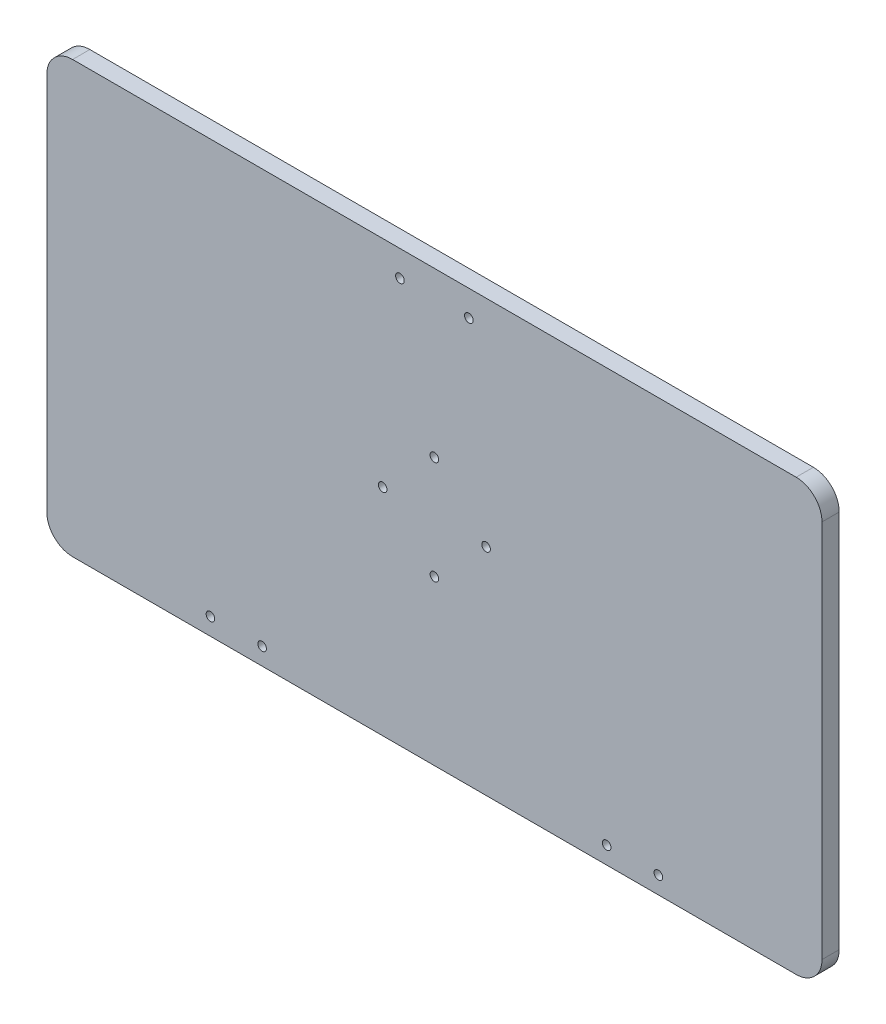
ISO-10303-21;
HEADER;
FILE_DESCRIPTION(('STEP AP214'),'2;1');
FILE_NAME('part.step','',(''),(''),'','','');
FILE_SCHEMA(('AUTOMOTIVE_DESIGN { 1 0 10303 214 1 1 1 1 }'));
ENDSEC;
DATA;
#1=APPLICATION_CONTEXT('core data for automotive mechanical design processes');
#2=APPLICATION_PROTOCOL_DEFINITION('international standard','automotive_design',2000,#1);
#3=PRODUCT_CONTEXT('',#1,'mechanical');
#4=PRODUCT('Part','Part','',(#3));
#5=PRODUCT_RELATED_PRODUCT_CATEGORY('part','',(#4));
#6=PRODUCT_DEFINITION_FORMATION('','',#4);
#7=PRODUCT_DEFINITION_CONTEXT('part definition',#1,'design');
#8=PRODUCT_DEFINITION('design','',#6,#7);
#9=PRODUCT_DEFINITION_SHAPE('','',#8);
#10=(LENGTH_UNIT() NAMED_UNIT(*) SI_UNIT(.MILLI.,.METRE.));
#11=(NAMED_UNIT(*) PLANE_ANGLE_UNIT() SI_UNIT($,.RADIAN.));
#12=(NAMED_UNIT(*) SI_UNIT($,.STERADIAN.) SOLID_ANGLE_UNIT());
#13=UNCERTAINTY_MEASURE_WITH_UNIT(LENGTH_MEASURE(1.E-05),#10,'distance_accuracy_value','');
#14=(GEOMETRIC_REPRESENTATION_CONTEXT(3) GLOBAL_UNCERTAINTY_ASSIGNED_CONTEXT((#13)) GLOBAL_UNIT_ASSIGNED_CONTEXT((#10,
#11,#12)) REPRESENTATION_CONTEXT('',''));
#15=CARTESIAN_POINT('',(0.,0.,0.));
#16=DIRECTION('',(0.,0.,1.));
#17=DIRECTION('',(1.,0.,0.));
#18=AXIS2_PLACEMENT_3D('',#15,#16,#17);
#19=CARTESIAN_POINT('',(435.,235.,10.));
#20=DIRECTION('',(0.,0.,-1.));
#21=DIRECTION('',(-1.,0.,0.));
#22=AXIS2_PLACEMENT_3D('',#19,#20,#21);
#23=PLANE('',#22);
#24=CARTESIAN_POINT('',(435.,235.,10.));
#25=DIRECTION('',(0.,0.,1.));
#26=DIRECTION('',(-1.,0.,0.));
#27=AXIS2_PLACEMENT_3D('',#24,#25,#26);
#28=CIRCLE('',#27,15.);
#29=CARTESIAN_POINT('',(450.,235.,10.));
#30=VERTEX_POINT('',#29);
#31=CARTESIAN_POINT('',(435.,250.,10.));
#32=VERTEX_POINT('',#31);
#33=EDGE_CURVE('E164',#30,#32,#28,.T.);
#34=ORIENTED_EDGE('',*,*,#33,.T.);
#35=DIRECTION('',(-1.,0.,0.));
#36=VECTOR('',#35,1.);
#37=CARTESIAN_POINT('',(15.,250.,10.));
#38=LINE('',#37,#36);
#39=CARTESIAN_POINT('',(15.,250.,10.));
#40=VERTEX_POINT('',#39);
#41=EDGE_CURVE('E100',#32,#40,#38,.T.);
#42=ORIENTED_EDGE('',*,*,#41,.T.);
#43=CARTESIAN_POINT('',(15.,235.,10.));
#44=DIRECTION('',(0.,0.,1.));
#45=DIRECTION('',(-1.,0.,0.));
#46=AXIS2_PLACEMENT_3D('',#43,#44,#45);
#47=CIRCLE('',#46,15.);
#48=CARTESIAN_POINT('',(0.,235.,10.));
#49=VERTEX_POINT('',#48);
#50=EDGE_CURVE('E185',#40,#49,#47,.T.);
#51=ORIENTED_EDGE('',*,*,#50,.T.);
#52=DIRECTION('',(0.,-1.,0.));
#53=VECTOR('',#52,1.);
#54=CARTESIAN_POINT('',(0.,15.0000000000001,10.));
#55=LINE('',#54,#53);
#56=CARTESIAN_POINT('',(0.,15.0000000000001,10.));
#57=VERTEX_POINT('',#56);
#58=EDGE_CURVE('E199',#49,#57,#55,.T.);
#59=ORIENTED_EDGE('',*,*,#58,.T.);
#60=CARTESIAN_POINT('',(15.,15.,10.));
#61=DIRECTION('',(0.,0.,1.));
#62=DIRECTION('',(-1.,0.,0.));
#63=AXIS2_PLACEMENT_3D('',#60,#61,#62);
#64=CIRCLE('',#63,15.);
#65=CARTESIAN_POINT('',(15.0000000000001,0.,10.));
#66=VERTEX_POINT('',#65);
#67=EDGE_CURVE('E119',#57,#66,#64,.T.);
#68=ORIENTED_EDGE('',*,*,#67,.T.);
#69=DIRECTION('',(1.,0.,0.));
#70=VECTOR('',#69,1.);
#71=CARTESIAN_POINT('',(15.0000000000001,0.,10.));
#72=LINE('',#71,#70);
#73=CARTESIAN_POINT('',(435.,0.,10.));
#74=VERTEX_POINT('',#73);
#75=EDGE_CURVE('E113',#66,#74,#72,.T.);
#76=ORIENTED_EDGE('',*,*,#75,.T.);
#77=CARTESIAN_POINT('',(435.,15.,10.));
#78=DIRECTION('',(0.,0.,1.));
#79=DIRECTION('',(1.,0.,0.));
#80=AXIS2_PLACEMENT_3D('',#77,#78,#79);
#81=CIRCLE('',#80,15.);
#82=CARTESIAN_POINT('',(450.,15.,10.));
#83=VERTEX_POINT('',#82);
#84=EDGE_CURVE('E117',#74,#83,#81,.T.);
#85=ORIENTED_EDGE('',*,*,#84,.T.);
#86=DIRECTION('',(0.,1.,0.));
#87=VECTOR('',#86,1.);
#88=CARTESIAN_POINT('',(450.,15.,10.));
#89=LINE('',#88,#87);
#90=EDGE_CURVE('E57',#83,#30,#89,.T.);
#91=ORIENTED_EDGE('',*,*,#90,.T.);
#92=EDGE_LOOP('',(#34,#42,#51,#59,#68,#76,#85,#91));
#93=FACE_BOUND('',#92,.T.);
#94=CARTESIAN_POINT('',(255.,125.,10.));
#95=DIRECTION('',(0.,0.,1.));
#96=DIRECTION('',(1.,0.,0.));
#97=AXIS2_PLACEMENT_3D('',#94,#95,#96);
#98=CIRCLE('',#97,2.50000000000002);
#99=CARTESIAN_POINT('',(257.5,125.,10.));
#100=VERTEX_POINT('',#99);
#101=EDGE_CURVE('E146',#100,#100,#98,.T.);
#102=ORIENTED_EDGE('',*,*,#101,.F.);
#103=EDGE_LOOP('',(#102));
#104=FACE_BOUND('',#103,.T.);
#105=CARTESIAN_POINT('',(225.,95.,10.));
#106=DIRECTION('',(0.,0.,1.));
#107=DIRECTION('',(1.,0.,0.));
#108=AXIS2_PLACEMENT_3D('',#105,#106,#107);
#109=CIRCLE('',#108,2.50000000000002);
#110=CARTESIAN_POINT('',(227.5,95.,10.));
#111=VERTEX_POINT('',#110);
#112=EDGE_CURVE('E213',#111,#111,#109,.T.);
#113=ORIENTED_EDGE('',*,*,#112,.F.);
#114=EDGE_LOOP('',(#113));
#115=FACE_BOUND('',#114,.T.);
#116=CARTESIAN_POINT('',(195.,125.,10.));
#117=DIRECTION('',(0.,0.,1.));
#118=DIRECTION('',(1.,0.,0.));
#119=AXIS2_PLACEMENT_3D('',#116,#117,#118);
#120=CIRCLE('',#119,2.50000000000001);
#121=CARTESIAN_POINT('',(197.5,125.,10.));
#122=VERTEX_POINT('',#121);
#123=EDGE_CURVE('E221',#122,#122,#120,.T.);
#124=ORIENTED_EDGE('',*,*,#123,.F.);
#125=EDGE_LOOP('',(#124));
#126=FACE_BOUND('',#125,.T.);
#127=CARTESIAN_POINT('',(225.,155.,10.));
#128=DIRECTION('',(0.,0.,1.));
#129=DIRECTION('',(1.,0.,0.));
#130=AXIS2_PLACEMENT_3D('',#127,#128,#129);
#131=CIRCLE('',#130,2.50000000000001);
#132=CARTESIAN_POINT('',(227.5,155.,10.));
#133=VERTEX_POINT('',#132);
#134=EDGE_CURVE('E229',#133,#133,#131,.T.);
#135=ORIENTED_EDGE('',*,*,#134,.F.);
#136=EDGE_LOOP('',(#135));
#137=FACE_BOUND('',#136,.T.);
#138=CARTESIAN_POINT('',(325.,10.,10.));
#139=DIRECTION('',(0.,0.,1.));
#140=DIRECTION('',(1.,0.,0.));
#141=AXIS2_PLACEMENT_3D('',#138,#139,#140);
#142=CIRCLE('',#141,2.50000000000002);
#143=CARTESIAN_POINT('',(327.5,10.,10.));
#144=VERTEX_POINT('',#143);
#145=EDGE_CURVE('E237',#144,#144,#142,.T.);
#146=ORIENTED_EDGE('',*,*,#145,.F.);
#147=EDGE_LOOP('',(#146));
#148=FACE_BOUND('',#147,.T.);
#149=CARTESIAN_POINT('',(355.,10.,10.));
#150=DIRECTION('',(0.,0.,1.));
#151=DIRECTION('',(1.,0.,0.));
#152=AXIS2_PLACEMENT_3D('',#149,#150,#151);
#153=CIRCLE('',#152,2.50000000000002);
#154=CARTESIAN_POINT('',(357.5,10.,10.));
#155=VERTEX_POINT('',#154);
#156=EDGE_CURVE('E245',#155,#155,#153,.T.);
#157=ORIENTED_EDGE('',*,*,#156,.F.);
#158=EDGE_LOOP('',(#157));
#159=FACE_BOUND('',#158,.T.);
#160=CARTESIAN_POINT('',(95.0000000000001,9.99999999999994,10.));
#161=DIRECTION('',(0.,0.,1.));
#162=DIRECTION('',(-1.,0.,0.));
#163=AXIS2_PLACEMENT_3D('',#160,#161,#162);
#164=CIRCLE('',#163,2.5);
#165=CARTESIAN_POINT('',(92.5000000000001,9.99999999999994,10.));
#166=VERTEX_POINT('',#165);
#167=EDGE_CURVE('E253',#166,#166,#164,.T.);
#168=ORIENTED_EDGE('',*,*,#167,.F.);
#169=EDGE_LOOP('',(#168));
#170=FACE_BOUND('',#169,.T.);
#171=CARTESIAN_POINT('',(125.,9.99999999999994,10.));
#172=DIRECTION('',(0.,0.,1.));
#173=DIRECTION('',(-1.,0.,0.));
#174=AXIS2_PLACEMENT_3D('',#171,#172,#173);
#175=CIRCLE('',#174,2.5);
#176=CARTESIAN_POINT('',(122.5,9.99999999999994,10.));
#177=VERTEX_POINT('',#176);
#178=EDGE_CURVE('E261',#177,#177,#175,.T.);
#179=ORIENTED_EDGE('',*,*,#178,.F.);
#180=EDGE_LOOP('',(#179));
#181=FACE_BOUND('',#180,.T.);
#182=CARTESIAN_POINT('',(205.,235.,10.));
#183=DIRECTION('',(0.,0.,1.));
#184=DIRECTION('',(1.,0.,0.));
#185=AXIS2_PLACEMENT_3D('',#182,#183,#184);
#186=CIRCLE('',#185,2.5);
#187=CARTESIAN_POINT('',(207.5,235.,10.));
#188=VERTEX_POINT('',#187);
#189=EDGE_CURVE('E269',#188,#188,#186,.T.);
#190=ORIENTED_EDGE('',*,*,#189,.F.);
#191=EDGE_LOOP('',(#190));
#192=FACE_BOUND('',#191,.T.);
#193=CARTESIAN_POINT('',(245.,235.,10.));
#194=DIRECTION('',(0.,0.,1.));
#195=DIRECTION('',(1.,0.,0.));
#196=AXIS2_PLACEMENT_3D('',#193,#194,#195);
#197=CIRCLE('',#196,2.50000000000002);
#198=CARTESIAN_POINT('',(247.5,235.,10.));
#199=VERTEX_POINT('',#198);
#200=EDGE_CURVE('E277',#199,#199,#197,.T.);
#201=ORIENTED_EDGE('',*,*,#200,.F.);
#202=EDGE_LOOP('',(#201));
#203=FACE_BOUND('',#202,.T.);
#204=ADVANCED_FACE('F39',(#93,#104,#115,#126,#137,#148,#159,#170,#181,#192,#203),#23,.F.);
#205=CARTESIAN_POINT('',(435.,235.,0.));
#206=DIRECTION('',(0.,0.,-1.));
#207=DIRECTION('',(-1.,0.,0.));
#208=AXIS2_PLACEMENT_3D('',#205,#206,#207);
#209=PLANE('',#208);
#210=CARTESIAN_POINT('',(205.,235.,0.));
#211=DIRECTION('',(0.,0.,1.));
#212=DIRECTION('',(1.,0.,0.));
#213=AXIS2_PLACEMENT_3D('',#210,#211,#212);
#214=CIRCLE('',#213,2.5);
#215=CARTESIAN_POINT('',(207.5,235.,0.));
#216=VERTEX_POINT('',#215);
#217=EDGE_CURVE('E273',#216,#216,#214,.T.);
#218=ORIENTED_EDGE('',*,*,#217,.T.);
#219=EDGE_LOOP('',(#218));
#220=FACE_BOUND('',#219,.T.);
#221=CARTESIAN_POINT('',(95.0000000000001,9.99999999999994,0.));
#222=DIRECTION('',(0.,0.,1.));
#223=DIRECTION('',(-1.,0.,0.));
#224=AXIS2_PLACEMENT_3D('',#221,#222,#223);
#225=CIRCLE('',#224,2.5);
#226=CARTESIAN_POINT('',(92.5000000000001,9.99999999999994,0.));
#227=VERTEX_POINT('',#226);
#228=EDGE_CURVE('E257',#227,#227,#225,.T.);
#229=ORIENTED_EDGE('',*,*,#228,.T.);
#230=EDGE_LOOP('',(#229));
#231=FACE_BOUND('',#230,.T.);
#232=CARTESIAN_POINT('',(325.,10.,0.));
#233=DIRECTION('',(0.,0.,1.));
#234=DIRECTION('',(1.,0.,0.));
#235=AXIS2_PLACEMENT_3D('',#232,#233,#234);
#236=CIRCLE('',#235,2.50000000000002);
#237=CARTESIAN_POINT('',(327.5,10.,0.));
#238=VERTEX_POINT('',#237);
#239=EDGE_CURVE('E241',#238,#238,#236,.T.);
#240=ORIENTED_EDGE('',*,*,#239,.T.);
#241=EDGE_LOOP('',(#240));
#242=FACE_BOUND('',#241,.T.);
#243=CARTESIAN_POINT('',(195.,125.,0.));
#244=DIRECTION('',(0.,0.,1.));
#245=DIRECTION('',(1.,0.,0.));
#246=AXIS2_PLACEMENT_3D('',#243,#244,#245);
#247=CIRCLE('',#246,2.50000000000001);
#248=CARTESIAN_POINT('',(197.5,125.,0.));
#249=VERTEX_POINT('',#248);
#250=EDGE_CURVE('E225',#249,#249,#247,.T.);
#251=ORIENTED_EDGE('',*,*,#250,.T.);
#252=EDGE_LOOP('',(#251));
#253=FACE_BOUND('',#252,.T.);
#254=CARTESIAN_POINT('',(255.,125.,0.));
#255=DIRECTION('',(0.,0.,1.));
#256=DIRECTION('',(1.,0.,0.));
#257=AXIS2_PLACEMENT_3D('',#254,#255,#256);
#258=CIRCLE('',#257,2.50000000000002);
#259=CARTESIAN_POINT('',(257.5,125.,0.));
#260=VERTEX_POINT('',#259);
#261=EDGE_CURVE('E209',#260,#260,#258,.T.);
#262=ORIENTED_EDGE('',*,*,#261,.T.);
#263=EDGE_LOOP('',(#262));
#264=FACE_BOUND('',#263,.T.);
#265=CARTESIAN_POINT('',(435.,235.,0.));
#266=DIRECTION('',(0.,0.,1.));
#267=DIRECTION('',(-1.,0.,0.));
#268=AXIS2_PLACEMENT_3D('',#265,#266,#267);
#269=CIRCLE('',#268,15.);
#270=CARTESIAN_POINT('',(450.,235.,0.));
#271=VERTEX_POINT('',#270);
#272=CARTESIAN_POINT('',(435.,250.,0.));
#273=VERTEX_POINT('',#272);
#274=EDGE_CURVE('E141',#271,#273,#269,.T.);
#275=ORIENTED_EDGE('',*,*,#274,.F.);
#276=DIRECTION('',(0.,1.,0.));
#277=VECTOR('',#276,1.);
#278=CARTESIAN_POINT('',(450.,15.,0.));
#279=LINE('',#278,#277);
#280=CARTESIAN_POINT('',(450.,15.,0.));
#281=VERTEX_POINT('',#280);
#282=EDGE_CURVE('E92',#281,#271,#279,.T.);
#283=ORIENTED_EDGE('',*,*,#282,.F.);
#284=CARTESIAN_POINT('',(435.,15.,0.));
#285=DIRECTION('',(0.,0.,1.));
#286=DIRECTION('',(1.,0.,0.));
#287=AXIS2_PLACEMENT_3D('',#284,#285,#286);
#288=CIRCLE('',#287,15.);
#289=CARTESIAN_POINT('',(435.,0.,0.));
#290=VERTEX_POINT('',#289);
#291=EDGE_CURVE('E86',#290,#281,#288,.T.);
#292=ORIENTED_EDGE('',*,*,#291,.F.);
#293=DIRECTION('',(1.,0.,0.));
#294=VECTOR('',#293,1.);
#295=CARTESIAN_POINT('',(15.0000000000001,0.,0.));
#296=LINE('',#295,#294);
#297=CARTESIAN_POINT('',(15.0000000000001,0.,0.));
#298=VERTEX_POINT('',#297);
#299=EDGE_CURVE('E128',#298,#290,#296,.T.);
#300=ORIENTED_EDGE('',*,*,#299,.F.);
#301=CARTESIAN_POINT('',(15.,15.,0.));
#302=DIRECTION('',(0.,0.,1.));
#303=DIRECTION('',(-1.,0.,0.));
#304=AXIS2_PLACEMENT_3D('',#301,#302,#303);
#305=CIRCLE('',#304,15.);
#306=CARTESIAN_POINT('',(0.,15.0000000000001,0.));
#307=VERTEX_POINT('',#306);
#308=EDGE_CURVE('E155',#307,#298,#305,.T.);
#309=ORIENTED_EDGE('',*,*,#308,.F.);
#310=DIRECTION('',(0.,-1.,0.));
#311=VECTOR('',#310,1.);
#312=CARTESIAN_POINT('',(0.,15.0000000000001,0.));
#313=LINE('',#312,#311);
#314=CARTESIAN_POINT('',(0.,235.,0.));
#315=VERTEX_POINT('',#314);
#316=EDGE_CURVE('E152',#315,#307,#313,.T.);
#317=ORIENTED_EDGE('',*,*,#316,.F.);
#318=CARTESIAN_POINT('',(15.,235.,0.));
#319=DIRECTION('',(0.,0.,1.));
#320=DIRECTION('',(-1.,0.,0.));
#321=AXIS2_PLACEMENT_3D('',#318,#319,#320);
#322=CIRCLE('',#321,15.);
#323=CARTESIAN_POINT('',(15.,250.,0.));
#324=VERTEX_POINT('',#323);
#325=EDGE_CURVE('E149',#324,#315,#322,.T.);
#326=ORIENTED_EDGE('',*,*,#325,.F.);
#327=DIRECTION('',(-1.,0.,0.));
#328=VECTOR('',#327,1.);
#329=CARTESIAN_POINT('',(15.,250.,0.));
#330=LINE('',#329,#328);
#331=EDGE_CURVE('E145',#273,#324,#330,.T.);
#332=ORIENTED_EDGE('',*,*,#331,.F.);
#333=EDGE_LOOP('',(#275,#283,#292,#300,#309,#317,#326,#332));
#334=FACE_BOUND('',#333,.T.);
#335=CARTESIAN_POINT('',(225.,95.,0.));
#336=DIRECTION('',(0.,0.,1.));
#337=DIRECTION('',(1.,0.,0.));
#338=AXIS2_PLACEMENT_3D('',#335,#336,#337);
#339=CIRCLE('',#338,2.50000000000002);
#340=CARTESIAN_POINT('',(227.5,95.,0.));
#341=VERTEX_POINT('',#340);
#342=EDGE_CURVE('E217',#341,#341,#339,.T.);
#343=ORIENTED_EDGE('',*,*,#342,.T.);
#344=EDGE_LOOP('',(#343));
#345=FACE_BOUND('',#344,.T.);
#346=CARTESIAN_POINT('',(225.,155.,0.));
#347=DIRECTION('',(0.,0.,1.));
#348=DIRECTION('',(1.,0.,0.));
#349=AXIS2_PLACEMENT_3D('',#346,#347,#348);
#350=CIRCLE('',#349,2.50000000000001);
#351=CARTESIAN_POINT('',(227.5,155.,0.));
#352=VERTEX_POINT('',#351);
#353=EDGE_CURVE('E233',#352,#352,#350,.T.);
#354=ORIENTED_EDGE('',*,*,#353,.T.);
#355=EDGE_LOOP('',(#354));
#356=FACE_BOUND('',#355,.T.);
#357=CARTESIAN_POINT('',(355.,10.,0.));
#358=DIRECTION('',(0.,0.,1.));
#359=DIRECTION('',(1.,0.,0.));
#360=AXIS2_PLACEMENT_3D('',#357,#358,#359);
#361=CIRCLE('',#360,2.50000000000002);
#362=CARTESIAN_POINT('',(357.5,10.,0.));
#363=VERTEX_POINT('',#362);
#364=EDGE_CURVE('E249',#363,#363,#361,.T.);
#365=ORIENTED_EDGE('',*,*,#364,.T.);
#366=EDGE_LOOP('',(#365));
#367=FACE_BOUND('',#366,.T.);
#368=CARTESIAN_POINT('',(125.,9.99999999999994,0.));
#369=DIRECTION('',(0.,0.,1.));
#370=DIRECTION('',(-1.,0.,0.));
#371=AXIS2_PLACEMENT_3D('',#368,#369,#370);
#372=CIRCLE('',#371,2.5);
#373=CARTESIAN_POINT('',(122.5,9.99999999999994,0.));
#374=VERTEX_POINT('',#373);
#375=EDGE_CURVE('E265',#374,#374,#372,.T.);
#376=ORIENTED_EDGE('',*,*,#375,.T.);
#377=EDGE_LOOP('',(#376));
#378=FACE_BOUND('',#377,.T.);
#379=CARTESIAN_POINT('',(245.,235.,0.));
#380=DIRECTION('',(0.,0.,1.));
#381=DIRECTION('',(1.,0.,0.));
#382=AXIS2_PLACEMENT_3D('',#379,#380,#381);
#383=CIRCLE('',#382,2.50000000000002);
#384=CARTESIAN_POINT('',(247.5,235.,0.));
#385=VERTEX_POINT('',#384);
#386=EDGE_CURVE('E281',#385,#385,#383,.T.);
#387=ORIENTED_EDGE('',*,*,#386,.T.);
#388=EDGE_LOOP('',(#387));
#389=FACE_BOUND('',#388,.T.);
#390=ADVANCED_FACE('F189',(#220,#231,#242,#253,#264,#334,#345,#356,#367,#378,#389),#209,.T.);
#391=CARTESIAN_POINT('',(435.,235.,10.));
#392=DIRECTION('',(0.,0.,-1.));
#393=DIRECTION('',(-1.,0.,0.));
#394=AXIS2_PLACEMENT_3D('',#391,#392,#393);
#395=CYLINDRICAL_SURFACE('',#394,15.);
#396=ORIENTED_EDGE('',*,*,#274,.T.);
#397=DIRECTION('',(0.,0.,-1.));
#398=VECTOR('',#397,1.);
#399=CARTESIAN_POINT('',(435.,250.,10.));
#400=LINE('',#399,#398);
#401=EDGE_CURVE('E11',#32,#273,#400,.T.);
#402=ORIENTED_EDGE('',*,*,#401,.F.);
#403=ORIENTED_EDGE('',*,*,#33,.F.);
#404=DIRECTION('',(0.,0.,-1.));
#405=VECTOR('',#404,1.);
#406=CARTESIAN_POINT('',(450.,235.,10.));
#407=LINE('',#406,#405);
#408=EDGE_CURVE('E137',#30,#271,#407,.T.);
#409=ORIENTED_EDGE('',*,*,#408,.T.);
#410=EDGE_LOOP('',(#396,#402,#403,#409));
#411=FACE_BOUND('',#410,.T.);
#412=ADVANCED_FACE('F41',(#411),#395,.T.);
#413=CARTESIAN_POINT('',(15.,250.,10.));
#414=DIRECTION('',(0.,-1.,0.));
#415=DIRECTION('',(0.,0.,-1.));
#416=AXIS2_PLACEMENT_3D('',#413,#414,#415);
#417=PLANE('',#416);
#418=ORIENTED_EDGE('',*,*,#331,.T.);
#419=DIRECTION('',(0.,0.,-1.));
#420=VECTOR('',#419,1.);
#421=CARTESIAN_POINT('',(15.,250.,10.));
#422=LINE('',#421,#420);
#423=EDGE_CURVE('E49',#40,#324,#422,.T.);
#424=ORIENTED_EDGE('',*,*,#423,.F.);
#425=ORIENTED_EDGE('',*,*,#41,.F.);
#426=ORIENTED_EDGE('',*,*,#401,.T.);
#427=EDGE_LOOP('',(#418,#424,#425,#426));
#428=FACE_BOUND('',#427,.T.);
#429=ADVANCED_FACE('F315',(#428),#417,.F.);
#430=CARTESIAN_POINT('',(15.,235.,10.));
#431=DIRECTION('',(0.,0.,-1.));
#432=DIRECTION('',(-1.,0.,0.));
#433=AXIS2_PLACEMENT_3D('',#430,#431,#432);
#434=CYLINDRICAL_SURFACE('',#433,15.);
#435=ORIENTED_EDGE('',*,*,#325,.T.);
#436=DIRECTION('',(0.,0.,-1.));
#437=VECTOR('',#436,1.);
#438=CARTESIAN_POINT('',(0.,235.,10.));
#439=LINE('',#438,#437);
#440=EDGE_CURVE('E175',#49,#315,#439,.T.);
#441=ORIENTED_EDGE('',*,*,#440,.F.);
#442=ORIENTED_EDGE('',*,*,#50,.F.);
#443=ORIENTED_EDGE('',*,*,#423,.T.);
#444=EDGE_LOOP('',(#435,#441,#442,#443));
#445=FACE_BOUND('',#444,.T.);
#446=ADVANCED_FACE('F183',(#445),#434,.T.);
#447=CARTESIAN_POINT('',(0.,15.0000000000001,10.));
#448=DIRECTION('',(1.,0.,0.));
#449=DIRECTION('',(0.,0.,-1.));
#450=AXIS2_PLACEMENT_3D('',#447,#448,#449);
#451=PLANE('',#450);
#452=ORIENTED_EDGE('',*,*,#316,.T.);
#453=DIRECTION('',(0.,0.,-1.));
#454=VECTOR('',#453,1.);
#455=CARTESIAN_POINT('',(0.,15.0000000000001,10.));
#456=LINE('',#455,#454);
#457=EDGE_CURVE('E171',#57,#307,#456,.T.);
#458=ORIENTED_EDGE('',*,*,#457,.F.);
#459=ORIENTED_EDGE('',*,*,#58,.F.);
#460=ORIENTED_EDGE('',*,*,#440,.T.);
#461=EDGE_LOOP('',(#452,#458,#459,#460));
#462=FACE_BOUND('',#461,.T.);
#463=ADVANCED_FACE('F194',(#462),#451,.F.);
#464=CARTESIAN_POINT('',(15.,15.,10.));
#465=DIRECTION('',(0.,0.,-1.));
#466=DIRECTION('',(-1.,0.,0.));
#467=AXIS2_PLACEMENT_3D('',#464,#465,#466);
#468=CYLINDRICAL_SURFACE('',#467,15.);
#469=ORIENTED_EDGE('',*,*,#308,.T.);
#470=DIRECTION('',(0.,0.,-1.));
#471=VECTOR('',#470,1.);
#472=CARTESIAN_POINT('',(15.0000000000001,0.,10.));
#473=LINE('',#472,#471);
#474=EDGE_CURVE('E130',#66,#298,#473,.T.);
#475=ORIENTED_EDGE('',*,*,#474,.F.);
#476=ORIENTED_EDGE('',*,*,#67,.F.);
#477=ORIENTED_EDGE('',*,*,#457,.T.);
#478=EDGE_LOOP('',(#469,#475,#476,#477));
#479=FACE_BOUND('',#478,.T.);
#480=ADVANCED_FACE('F197',(#479),#468,.T.);
#481=CARTESIAN_POINT('',(15.0000000000001,0.,10.));
#482=DIRECTION('',(0.,1.,0.));
#483=DIRECTION('',(-1.,0.,0.));
#484=AXIS2_PLACEMENT_3D('',#481,#482,#483);
#485=PLANE('',#484);
#486=ORIENTED_EDGE('',*,*,#299,.T.);
#487=DIRECTION('',(0.,0.,-1.));
#488=VECTOR('',#487,1.);
#489=CARTESIAN_POINT('',(435.,0.,10.));
#490=LINE('',#489,#488);
#491=EDGE_CURVE('E125',#74,#290,#490,.T.);
#492=ORIENTED_EDGE('',*,*,#491,.F.);
#493=ORIENTED_EDGE('',*,*,#75,.F.);
#494=ORIENTED_EDGE('',*,*,#474,.T.);
#495=EDGE_LOOP('',(#486,#492,#493,#494));
#496=FACE_BOUND('',#495,.T.);
#497=ADVANCED_FACE('F126',(#496),#485,.F.);
#498=CARTESIAN_POINT('',(435.,15.,10.));
#499=DIRECTION('',(0.,0.,-1.));
#500=DIRECTION('',(-1.,0.,0.));
#501=AXIS2_PLACEMENT_3D('',#498,#499,#500);
#502=CYLINDRICAL_SURFACE('',#501,15.);
#503=ORIENTED_EDGE('',*,*,#291,.T.);
#504=DIRECTION('',(0.,0.,-1.));
#505=VECTOR('',#504,1.);
#506=CARTESIAN_POINT('',(450.,15.,10.));
#507=LINE('',#506,#505);
#508=EDGE_CURVE('E131',#83,#281,#507,.T.);
#509=ORIENTED_EDGE('',*,*,#508,.F.);
#510=ORIENTED_EDGE('',*,*,#84,.F.);
#511=ORIENTED_EDGE('',*,*,#491,.T.);
#512=EDGE_LOOP('',(#503,#509,#510,#511));
#513=FACE_BOUND('',#512,.T.);
#514=ADVANCED_FACE('F133',(#513),#502,.T.);
#515=CARTESIAN_POINT('',(450.,15.,10.));
#516=DIRECTION('',(-1.,0.,0.));
#517=DIRECTION('',(0.,0.,1.));
#518=AXIS2_PLACEMENT_3D('',#515,#516,#517);
#519=PLANE('',#518);
#520=ORIENTED_EDGE('',*,*,#282,.T.);
#521=ORIENTED_EDGE('',*,*,#408,.F.);
#522=ORIENTED_EDGE('',*,*,#90,.F.);
#523=ORIENTED_EDGE('',*,*,#508,.T.);
#524=EDGE_LOOP('',(#520,#521,#522,#523));
#525=FACE_BOUND('',#524,.T.);
#526=ADVANCED_FACE('F303',(#525),#519,.F.);
#527=CARTESIAN_POINT('',(255.,125.,10.));
#528=DIRECTION('',(0.,0.,-1.));
#529=DIRECTION('',(-1.,0.,0.));
#530=AXIS2_PLACEMENT_3D('',#527,#528,#529);
#531=CYLINDRICAL_SURFACE('',#530,2.50000000000002);
#532=ORIENTED_EDGE('',*,*,#101,.T.);
#533=EDGE_LOOP('',(#532));
#534=FACE_BOUND('',#533,.T.);
#535=ORIENTED_EDGE('',*,*,#261,.F.);
#536=EDGE_LOOP('',(#535));
#537=FACE_BOUND('',#536,.T.);
#538=ADVANCED_FACE('F300',(#534,#537),#531,.F.);
#539=CARTESIAN_POINT('',(225.,95.,10.));
#540=DIRECTION('',(0.,0.,-1.));
#541=DIRECTION('',(-1.,0.,0.));
#542=AXIS2_PLACEMENT_3D('',#539,#540,#541);
#543=CYLINDRICAL_SURFACE('',#542,2.50000000000002);
#544=ORIENTED_EDGE('',*,*,#112,.T.);
#545=EDGE_LOOP('',(#544));
#546=FACE_BOUND('',#545,.T.);
#547=ORIENTED_EDGE('',*,*,#342,.F.);
#548=EDGE_LOOP('',(#547));
#549=FACE_BOUND('',#548,.T.);
#550=ADVANCED_FACE('F379',(#546,#549),#543,.F.);
#551=CARTESIAN_POINT('',(195.,125.,10.));
#552=DIRECTION('',(0.,0.,-1.));
#553=DIRECTION('',(-1.,0.,0.));
#554=AXIS2_PLACEMENT_3D('',#551,#552,#553);
#555=CYLINDRICAL_SURFACE('',#554,2.50000000000001);
#556=ORIENTED_EDGE('',*,*,#123,.T.);
#557=EDGE_LOOP('',(#556));
#558=FACE_BOUND('',#557,.T.);
#559=ORIENTED_EDGE('',*,*,#250,.F.);
#560=EDGE_LOOP('',(#559));
#561=FACE_BOUND('',#560,.T.);
#562=ADVANCED_FACE('F387',(#558,#561),#555,.F.);
#563=CARTESIAN_POINT('',(225.,155.,10.));
#564=DIRECTION('',(0.,0.,-1.));
#565=DIRECTION('',(-1.,0.,0.));
#566=AXIS2_PLACEMENT_3D('',#563,#564,#565);
#567=CYLINDRICAL_SURFACE('',#566,2.50000000000001);
#568=ORIENTED_EDGE('',*,*,#134,.T.);
#569=EDGE_LOOP('',(#568));
#570=FACE_BOUND('',#569,.T.);
#571=ORIENTED_EDGE('',*,*,#353,.F.);
#572=EDGE_LOOP('',(#571));
#573=FACE_BOUND('',#572,.T.);
#574=ADVANCED_FACE('F395',(#570,#573),#567,.F.);
#575=CARTESIAN_POINT('',(325.,10.,10.));
#576=DIRECTION('',(0.,0.,-1.));
#577=DIRECTION('',(-1.,0.,0.));
#578=AXIS2_PLACEMENT_3D('',#575,#576,#577);
#579=CYLINDRICAL_SURFACE('',#578,2.50000000000002);
#580=ORIENTED_EDGE('',*,*,#145,.T.);
#581=EDGE_LOOP('',(#580));
#582=FACE_BOUND('',#581,.T.);
#583=ORIENTED_EDGE('',*,*,#239,.F.);
#584=EDGE_LOOP('',(#583));
#585=FACE_BOUND('',#584,.T.);
#586=ADVANCED_FACE('F404',(#582,#585),#579,.F.);
#587=CARTESIAN_POINT('',(355.,10.,10.));
#588=DIRECTION('',(0.,0.,-1.));
#589=DIRECTION('',(-1.,0.,0.));
#590=AXIS2_PLACEMENT_3D('',#587,#588,#589);
#591=CYLINDRICAL_SURFACE('',#590,2.50000000000002);
#592=ORIENTED_EDGE('',*,*,#156,.T.);
#593=EDGE_LOOP('',(#592));
#594=FACE_BOUND('',#593,.T.);
#595=ORIENTED_EDGE('',*,*,#364,.F.);
#596=EDGE_LOOP('',(#595));
#597=FACE_BOUND('',#596,.T.);
#598=ADVANCED_FACE('F413',(#594,#597),#591,.F.);
#599=CARTESIAN_POINT('',(95.0000000000001,9.99999999999994,10.));
#600=DIRECTION('',(0.,0.,-1.));
#601=DIRECTION('',(-1.,0.,0.));
#602=AXIS2_PLACEMENT_3D('',#599,#600,#601);
#603=CYLINDRICAL_SURFACE('',#602,2.5);
#604=ORIENTED_EDGE('',*,*,#167,.T.);
#605=EDGE_LOOP('',(#604));
#606=FACE_BOUND('',#605,.T.);
#607=ORIENTED_EDGE('',*,*,#228,.F.);
#608=EDGE_LOOP('',(#607));
#609=FACE_BOUND('',#608,.T.);
#610=ADVANCED_FACE('F422',(#606,#609),#603,.F.);
#611=CARTESIAN_POINT('',(125.,9.99999999999994,10.));
#612=DIRECTION('',(0.,0.,-1.));
#613=DIRECTION('',(-1.,0.,0.));
#614=AXIS2_PLACEMENT_3D('',#611,#612,#613);
#615=CYLINDRICAL_SURFACE('',#614,2.5);
#616=ORIENTED_EDGE('',*,*,#178,.T.);
#617=EDGE_LOOP('',(#616));
#618=FACE_BOUND('',#617,.T.);
#619=ORIENTED_EDGE('',*,*,#375,.F.);
#620=EDGE_LOOP('',(#619));
#621=FACE_BOUND('',#620,.T.);
#622=ADVANCED_FACE('F431',(#618,#621),#615,.F.);
#623=CARTESIAN_POINT('',(205.,235.,10.));
#624=DIRECTION('',(0.,0.,-1.));
#625=DIRECTION('',(-1.,0.,0.));
#626=AXIS2_PLACEMENT_3D('',#623,#624,#625);
#627=CYLINDRICAL_SURFACE('',#626,2.5);
#628=ORIENTED_EDGE('',*,*,#189,.T.);
#629=EDGE_LOOP('',(#628));
#630=FACE_BOUND('',#629,.T.);
#631=ORIENTED_EDGE('',*,*,#217,.F.);
#632=EDGE_LOOP('',(#631));
#633=FACE_BOUND('',#632,.T.);
#634=ADVANCED_FACE('F440',(#630,#633),#627,.F.);
#635=CARTESIAN_POINT('',(245.,235.,10.));
#636=DIRECTION('',(0.,0.,-1.));
#637=DIRECTION('',(-1.,0.,0.));
#638=AXIS2_PLACEMENT_3D('',#635,#636,#637);
#639=CYLINDRICAL_SURFACE('',#638,2.50000000000002);
#640=ORIENTED_EDGE('',*,*,#200,.T.);
#641=EDGE_LOOP('',(#640));
#642=FACE_BOUND('',#641,.T.);
#643=ORIENTED_EDGE('',*,*,#386,.F.);
#644=EDGE_LOOP('',(#643));
#645=FACE_BOUND('',#644,.T.);
#646=ADVANCED_FACE('F289',(#642,#645),#639,.F.);
#647=CLOSED_SHELL('',(#204,#390,#412,#429,#446,#463,#480,#497,#514,#526,#538,#550,#562,#574,
#586,#598,#610,#622,#634,#646));
#648=MANIFOLD_SOLID_BREP('B2',#647);
#649=ADVANCED_BREP_SHAPE_REPRESENTATION('',(#18,#648),#14);
#650=SHAPE_DEFINITION_REPRESENTATION(#9,#649);
ENDSEC;
END-ISO-10303-21;
